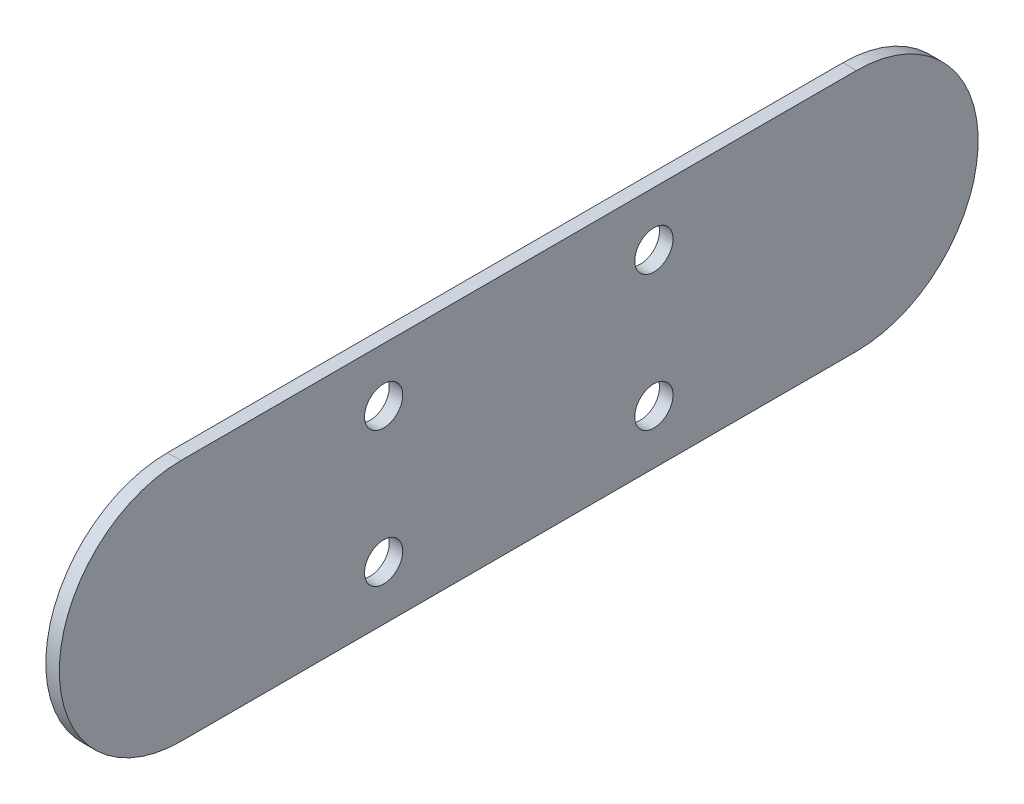
ISO-10303-21;
HEADER;
FILE_DESCRIPTION(('STEP AP214'),'2;1');
FILE_NAME('part.step','',(''),(''),'','','');
FILE_SCHEMA(('AUTOMOTIVE_DESIGN { 1 0 10303 214 1 1 1 1 }'));
ENDSEC;
DATA;
#1=APPLICATION_CONTEXT('core data for automotive mechanical design processes');
#2=APPLICATION_PROTOCOL_DEFINITION('international standard','automotive_design',2000,#1);
#3=PRODUCT_CONTEXT('',#1,'mechanical');
#4=PRODUCT('Part','Part','',(#3));
#5=PRODUCT_RELATED_PRODUCT_CATEGORY('part','',(#4));
#6=PRODUCT_DEFINITION_FORMATION('','',#4);
#7=PRODUCT_DEFINITION_CONTEXT('part definition',#1,'design');
#8=PRODUCT_DEFINITION('design','',#6,#7);
#9=PRODUCT_DEFINITION_SHAPE('','',#8);
#10=(LENGTH_UNIT() NAMED_UNIT(*) SI_UNIT(.MILLI.,.METRE.));
#11=(NAMED_UNIT(*) PLANE_ANGLE_UNIT() SI_UNIT($,.RADIAN.));
#12=(NAMED_UNIT(*) SI_UNIT($,.STERADIAN.) SOLID_ANGLE_UNIT());
#13=UNCERTAINTY_MEASURE_WITH_UNIT(LENGTH_MEASURE(1.E-05),#10,'distance_accuracy_value','');
#14=(GEOMETRIC_REPRESENTATION_CONTEXT(3) GLOBAL_UNCERTAINTY_ASSIGNED_CONTEXT((#13)) GLOBAL_UNIT_ASSIGNED_CONTEXT((#10,
#11,#12)) REPRESENTATION_CONTEXT('',''));
#15=CARTESIAN_POINT('',(0.,0.,0.));
#16=DIRECTION('',(0.,0.,1.));
#17=DIRECTION('',(1.,0.,0.));
#18=AXIS2_PLACEMENT_3D('',#15,#16,#17);
#19=CARTESIAN_POINT('',(1.5875,0.,-39.6875));
#20=DIRECTION('',(-1.,0.,0.));
#21=DIRECTION('',(0.,0.,1.));
#22=AXIS2_PLACEMENT_3D('',#19,#20,#21);
#23=CYLINDRICAL_SURFACE('',#22,14.2875);
#24=CARTESIAN_POINT('',(0.,0.,-39.6875));
#25=DIRECTION('',(1.,0.,0.));
#26=DIRECTION('',(0.,0.,-1.));
#27=AXIS2_PLACEMENT_3D('',#24,#25,#26);
#28=CIRCLE('',#27,14.2875);
#29=CARTESIAN_POINT('',(0.,-14.2875,-39.6875));
#30=VERTEX_POINT('',#29);
#31=CARTESIAN_POINT('',(0.,14.2875,-39.6875));
#32=VERTEX_POINT('',#31);
#33=EDGE_CURVE('E96',#30,#32,#28,.T.);
#34=ORIENTED_EDGE('',*,*,#33,.T.);
#35=DIRECTION('',(-1.,0.,0.));
#36=VECTOR('',#35,1.);
#37=CARTESIAN_POINT('',(1.5875,14.2875,-39.6875));
#38=LINE('',#37,#36);
#39=CARTESIAN_POINT('',(1.5875,14.2875,-39.6875));
#40=VERTEX_POINT('',#39);
#41=EDGE_CURVE('E11',#40,#32,#38,.T.);
#42=ORIENTED_EDGE('',*,*,#41,.F.);
#43=CARTESIAN_POINT('',(1.5875,0.,-39.6875));
#44=DIRECTION('',(1.,0.,0.));
#45=DIRECTION('',(0.,0.,-1.));
#46=AXIS2_PLACEMENT_3D('',#43,#44,#45);
#47=CIRCLE('',#46,14.2875);
#48=CARTESIAN_POINT('',(1.5875,-14.2875,-39.6875));
#49=VERTEX_POINT('',#48);
#50=EDGE_CURVE('E84',#49,#40,#47,.T.);
#51=ORIENTED_EDGE('',*,*,#50,.F.);
#52=DIRECTION('',(-1.,0.,0.));
#53=VECTOR('',#52,1.);
#54=CARTESIAN_POINT('',(1.5875,-14.2875,-39.6875));
#55=LINE('',#54,#53);
#56=EDGE_CURVE('E92',#49,#30,#55,.T.);
#57=ORIENTED_EDGE('',*,*,#56,.T.);
#58=EDGE_LOOP('',(#34,#42,#51,#57));
#59=FACE_BOUND('',#58,.T.);
#60=ADVANCED_FACE('F33',(#59),#23,.T.);
#61=CARTESIAN_POINT('',(1.5875,14.2875,-39.6875));
#62=DIRECTION('',(0.,-1.,0.));
#63=DIRECTION('',(0.,0.,-1.));
#64=AXIS2_PLACEMENT_3D('',#61,#62,#63);
#65=PLANE('',#64);
#66=DIRECTION('',(0.,0.,1.));
#67=VECTOR('',#66,1.);
#68=CARTESIAN_POINT('',(0.,14.2875,-39.6875));
#69=LINE('',#68,#67);
#70=CARTESIAN_POINT('',(0.,14.2875,39.6875));
#71=VERTEX_POINT('',#70);
#72=EDGE_CURVE('E88',#32,#71,#69,.T.);
#73=ORIENTED_EDGE('',*,*,#72,.T.);
#74=DIRECTION('',(-1.,0.,0.));
#75=VECTOR('',#74,1.);
#76=CARTESIAN_POINT('',(1.5875,14.2875,39.6875));
#77=LINE('',#76,#75);
#78=CARTESIAN_POINT('',(1.5875,14.2875,39.6875));
#79=VERTEX_POINT('',#78);
#80=EDGE_CURVE('E41',#79,#71,#77,.T.);
#81=ORIENTED_EDGE('',*,*,#80,.F.);
#82=DIRECTION('',(0.,0.,1.));
#83=VECTOR('',#82,1.);
#84=CARTESIAN_POINT('',(1.5875,14.2875,-39.6875));
#85=LINE('',#84,#83);
#86=EDGE_CURVE('E79',#40,#79,#85,.T.);
#87=ORIENTED_EDGE('',*,*,#86,.F.);
#88=ORIENTED_EDGE('',*,*,#41,.T.);
#89=EDGE_LOOP('',(#73,#81,#87,#88));
#90=FACE_BOUND('',#89,.T.);
#91=ADVANCED_FACE('F87',(#90),#65,.F.);
#92=CARTESIAN_POINT('',(1.5875,0.,39.6875));
#93=DIRECTION('',(-1.,0.,0.));
#94=DIRECTION('',(0.,0.,1.));
#95=AXIS2_PLACEMENT_3D('',#92,#93,#94);
#96=CYLINDRICAL_SURFACE('',#95,14.2875);
#97=CARTESIAN_POINT('',(0.,0.,39.6875));
#98=DIRECTION('',(1.,0.,0.));
#99=DIRECTION('',(0.,0.,-1.));
#100=AXIS2_PLACEMENT_3D('',#97,#98,#99);
#101=CIRCLE('',#100,14.2875);
#102=CARTESIAN_POINT('',(0.,-14.2875,39.6875));
#103=VERTEX_POINT('',#102);
#104=EDGE_CURVE('E66',#71,#103,#101,.T.);
#105=ORIENTED_EDGE('',*,*,#104,.T.);
#106=DIRECTION('',(-1.,0.,0.));
#107=VECTOR('',#106,1.);
#108=CARTESIAN_POINT('',(1.5875,-14.2875,39.6875));
#109=LINE('',#108,#107);
#110=CARTESIAN_POINT('',(1.5875,-14.2875,39.6875));
#111=VERTEX_POINT('',#110);
#112=EDGE_CURVE('E89',#111,#103,#109,.T.);
#113=ORIENTED_EDGE('',*,*,#112,.F.);
#114=CARTESIAN_POINT('',(1.5875,0.,39.6875));
#115=DIRECTION('',(1.,0.,0.));
#116=DIRECTION('',(0.,0.,-1.));
#117=AXIS2_PLACEMENT_3D('',#114,#115,#116);
#118=CIRCLE('',#117,14.2875);
#119=EDGE_CURVE('E82',#79,#111,#118,.T.);
#120=ORIENTED_EDGE('',*,*,#119,.F.);
#121=ORIENTED_EDGE('',*,*,#80,.T.);
#122=EDGE_LOOP('',(#105,#113,#120,#121));
#123=FACE_BOUND('',#122,.T.);
#124=ADVANCED_FACE('F90',(#123),#96,.T.);
#125=CARTESIAN_POINT('',(1.5875,-14.2875,-39.6875));
#126=DIRECTION('',(0.,1.,0.));
#127=DIRECTION('',(0.,0.,1.));
#128=AXIS2_PLACEMENT_3D('',#125,#126,#127);
#129=PLANE('',#128);
#130=DIRECTION('',(0.,0.,-1.));
#131=VECTOR('',#130,1.);
#132=CARTESIAN_POINT('',(0.,-14.2875,-39.6875));
#133=LINE('',#132,#131);
#134=EDGE_CURVE('E72',#103,#30,#133,.T.);
#135=ORIENTED_EDGE('',*,*,#134,.T.);
#136=ORIENTED_EDGE('',*,*,#56,.F.);
#137=DIRECTION('',(0.,0.,-1.));
#138=VECTOR('',#137,1.);
#139=CARTESIAN_POINT('',(1.5875,-14.2875,-39.6875));
#140=LINE('',#139,#138);
#141=EDGE_CURVE('E49',#111,#49,#140,.T.);
#142=ORIENTED_EDGE('',*,*,#141,.F.);
#143=ORIENTED_EDGE('',*,*,#112,.T.);
#144=EDGE_LOOP('',(#135,#136,#142,#143));
#145=FACE_BOUND('',#144,.T.);
#146=ADVANCED_FACE('F104',(#145),#129,.F.);
#147=CARTESIAN_POINT('',(1.5875,0.,-39.6875));
#148=DIRECTION('',(1.,0.,0.));
#149=DIRECTION('',(0.,0.,-1.));
#150=AXIS2_PLACEMENT_3D('',#147,#148,#149);
#151=PLANE('',#150);
#152=CARTESIAN_POINT('',(1.5875,7.9375,15.875));
#153=DIRECTION('',(1.,0.,0.));
#154=DIRECTION('',(0.,0.,-1.));
#155=AXIS2_PLACEMENT_3D('',#152,#153,#154);
#156=CIRCLE('',#155,2.24789999999999);
#157=CARTESIAN_POINT('',(1.5875,7.9375,13.6271));
#158=VERTEX_POINT('',#157);
#159=EDGE_CURVE('E130',#158,#158,#156,.T.);
#160=ORIENTED_EDGE('',*,*,#159,.F.);
#161=EDGE_LOOP('',(#160));
#162=FACE_BOUND('',#161,.T.);
#163=CARTESIAN_POINT('',(1.5875,-7.9375,15.875));
#164=DIRECTION('',(1.,0.,0.));
#165=DIRECTION('',(0.,0.,-1.));
#166=AXIS2_PLACEMENT_3D('',#163,#164,#165);
#167=CIRCLE('',#166,2.24789999999999);
#168=CARTESIAN_POINT('',(1.5875,-7.9375,13.6271));
#169=VERTEX_POINT('',#168);
#170=EDGE_CURVE('E124',#169,#169,#167,.T.);
#171=ORIENTED_EDGE('',*,*,#170,.F.);
#172=EDGE_LOOP('',(#171));
#173=FACE_BOUND('',#172,.T.);
#174=CARTESIAN_POINT('',(1.5875,-7.9375,-15.875));
#175=DIRECTION('',(1.,0.,0.));
#176=DIRECTION('',(0.,0.,-1.));
#177=AXIS2_PLACEMENT_3D('',#174,#175,#176);
#178=CIRCLE('',#177,2.24789999999999);
#179=CARTESIAN_POINT('',(1.5875,-7.9375,-18.1229));
#180=VERTEX_POINT('',#179);
#181=EDGE_CURVE('E118',#180,#180,#178,.T.);
#182=ORIENTED_EDGE('',*,*,#181,.F.);
#183=EDGE_LOOP('',(#182));
#184=FACE_BOUND('',#183,.T.);
#185=CARTESIAN_POINT('',(1.5875,7.9375,-15.875));
#186=DIRECTION('',(1.,0.,0.));
#187=DIRECTION('',(0.,0.,-1.));
#188=AXIS2_PLACEMENT_3D('',#185,#186,#187);
#189=CIRCLE('',#188,2.24789999999999);
#190=CARTESIAN_POINT('',(1.5875,7.9375,-18.1229));
#191=VERTEX_POINT('',#190);
#192=EDGE_CURVE('E112',#191,#191,#189,.T.);
#193=ORIENTED_EDGE('',*,*,#192,.F.);
#194=EDGE_LOOP('',(#193));
#195=FACE_BOUND('',#194,.T.);
#196=ORIENTED_EDGE('',*,*,#50,.T.);
#197=ORIENTED_EDGE('',*,*,#86,.T.);
#198=ORIENTED_EDGE('',*,*,#119,.T.);
#199=ORIENTED_EDGE('',*,*,#141,.T.);
#200=EDGE_LOOP('',(#196,#197,#198,#199));
#201=FACE_BOUND('',#200,.T.);
#202=ADVANCED_FACE('F80',(#162,#173,#184,#195,#201),#151,.T.);
#203=CARTESIAN_POINT('',(0.,0.,-39.6875));
#204=DIRECTION('',(1.,0.,0.));
#205=DIRECTION('',(0.,0.,-1.));
#206=AXIS2_PLACEMENT_3D('',#203,#204,#205);
#207=PLANE('',#206);
#208=CARTESIAN_POINT('',(0.,7.9375,15.875));
#209=DIRECTION('',(1.,0.,0.));
#210=DIRECTION('',(0.,0.,-1.));
#211=AXIS2_PLACEMENT_3D('',#208,#209,#210);
#212=CIRCLE('',#211,2.24789999999999);
#213=CARTESIAN_POINT('',(0.,7.9375,13.6271));
#214=VERTEX_POINT('',#213);
#215=EDGE_CURVE('E127',#214,#214,#212,.T.);
#216=ORIENTED_EDGE('',*,*,#215,.T.);
#217=EDGE_LOOP('',(#216));
#218=FACE_BOUND('',#217,.T.);
#219=CARTESIAN_POINT('',(0.,-7.9375,15.875));
#220=DIRECTION('',(1.,0.,0.));
#221=DIRECTION('',(0.,0.,-1.));
#222=AXIS2_PLACEMENT_3D('',#219,#220,#221);
#223=CIRCLE('',#222,2.24789999999999);
#224=CARTESIAN_POINT('',(0.,-7.9375,13.6271));
#225=VERTEX_POINT('',#224);
#226=EDGE_CURVE('E121',#225,#225,#223,.T.);
#227=ORIENTED_EDGE('',*,*,#226,.T.);
#228=EDGE_LOOP('',(#227));
#229=FACE_BOUND('',#228,.T.);
#230=CARTESIAN_POINT('',(0.,-7.9375,-15.875));
#231=DIRECTION('',(1.,0.,0.));
#232=DIRECTION('',(0.,0.,-1.));
#233=AXIS2_PLACEMENT_3D('',#230,#231,#232);
#234=CIRCLE('',#233,2.24789999999999);
#235=CARTESIAN_POINT('',(0.,-7.9375,-18.1229));
#236=VERTEX_POINT('',#235);
#237=EDGE_CURVE('E115',#236,#236,#234,.T.);
#238=ORIENTED_EDGE('',*,*,#237,.T.);
#239=EDGE_LOOP('',(#238));
#240=FACE_BOUND('',#239,.T.);
#241=CARTESIAN_POINT('',(0.,7.9375,-15.875));
#242=DIRECTION('',(1.,0.,0.));
#243=DIRECTION('',(0.,0.,-1.));
#244=AXIS2_PLACEMENT_3D('',#241,#242,#243);
#245=CIRCLE('',#244,2.24789999999999);
#246=CARTESIAN_POINT('',(0.,7.9375,-18.1229));
#247=VERTEX_POINT('',#246);
#248=EDGE_CURVE('E99',#247,#247,#245,.T.);
#249=ORIENTED_EDGE('',*,*,#248,.T.);
#250=EDGE_LOOP('',(#249));
#251=FACE_BOUND('',#250,.T.);
#252=ORIENTED_EDGE('',*,*,#33,.F.);
#253=ORIENTED_EDGE('',*,*,#134,.F.);
#254=ORIENTED_EDGE('',*,*,#104,.F.);
#255=ORIENTED_EDGE('',*,*,#72,.F.);
#256=EDGE_LOOP('',(#252,#253,#254,#255));
#257=FACE_BOUND('',#256,.T.);
#258=ADVANCED_FACE('F107',(#218,#229,#240,#251,#257),#207,.F.);
#259=CARTESIAN_POINT('',(1.5875,7.9375,-15.875));
#260=DIRECTION('',(1.,0.,0.));
#261=DIRECTION('',(0.,0.,-1.));
#262=AXIS2_PLACEMENT_3D('',#259,#260,#261);
#263=CYLINDRICAL_SURFACE('',#262,2.24789999999999);
#264=ORIENTED_EDGE('',*,*,#248,.F.);
#265=EDGE_LOOP('',(#264));
#266=FACE_BOUND('',#265,.T.);
#267=ORIENTED_EDGE('',*,*,#192,.T.);
#268=EDGE_LOOP('',(#267));
#269=FACE_BOUND('',#268,.T.);
#270=ADVANCED_FACE('F145',(#266,#269),#263,.F.);
#271=CARTESIAN_POINT('',(1.5875,-7.9375,-15.875));
#272=DIRECTION('',(1.,0.,0.));
#273=DIRECTION('',(0.,0.,-1.));
#274=AXIS2_PLACEMENT_3D('',#271,#272,#273);
#275=CYLINDRICAL_SURFACE('',#274,2.24789999999999);
#276=ORIENTED_EDGE('',*,*,#237,.F.);
#277=EDGE_LOOP('',(#276));
#278=FACE_BOUND('',#277,.T.);
#279=ORIENTED_EDGE('',*,*,#181,.T.);
#280=EDGE_LOOP('',(#279));
#281=FACE_BOUND('',#280,.T.);
#282=ADVANCED_FACE('F147',(#278,#281),#275,.F.);
#283=CARTESIAN_POINT('',(1.5875,-7.9375,15.875));
#284=DIRECTION('',(1.,0.,0.));
#285=DIRECTION('',(0.,0.,-1.));
#286=AXIS2_PLACEMENT_3D('',#283,#284,#285);
#287=CYLINDRICAL_SURFACE('',#286,2.24789999999999);
#288=ORIENTED_EDGE('',*,*,#226,.F.);
#289=EDGE_LOOP('',(#288));
#290=FACE_BOUND('',#289,.T.);
#291=ORIENTED_EDGE('',*,*,#170,.T.);
#292=EDGE_LOOP('',(#291));
#293=FACE_BOUND('',#292,.T.);
#294=ADVANCED_FACE('F154',(#290,#293),#287,.F.);
#295=CARTESIAN_POINT('',(1.5875,7.9375,15.875));
#296=DIRECTION('',(1.,0.,0.));
#297=DIRECTION('',(0.,0.,-1.));
#298=AXIS2_PLACEMENT_3D('',#295,#296,#297);
#299=CYLINDRICAL_SURFACE('',#298,2.24789999999999);
#300=ORIENTED_EDGE('',*,*,#215,.F.);
#301=EDGE_LOOP('',(#300));
#302=FACE_BOUND('',#301,.T.);
#303=ORIENTED_EDGE('',*,*,#159,.T.);
#304=EDGE_LOOP('',(#303));
#305=FACE_BOUND('',#304,.T.);
#306=ADVANCED_FACE('F134',(#302,#305),#299,.F.);
#307=CLOSED_SHELL('',(#60,#91,#124,#146,#202,#258,#270,#282,#294,#306));
#308=MANIFOLD_SOLID_BREP('B2',#307);
#309=ADVANCED_BREP_SHAPE_REPRESENTATION('',(#18,#308),#14);
#310=SHAPE_DEFINITION_REPRESENTATION(#9,#309);
ENDSEC;
END-ISO-10303-21;
